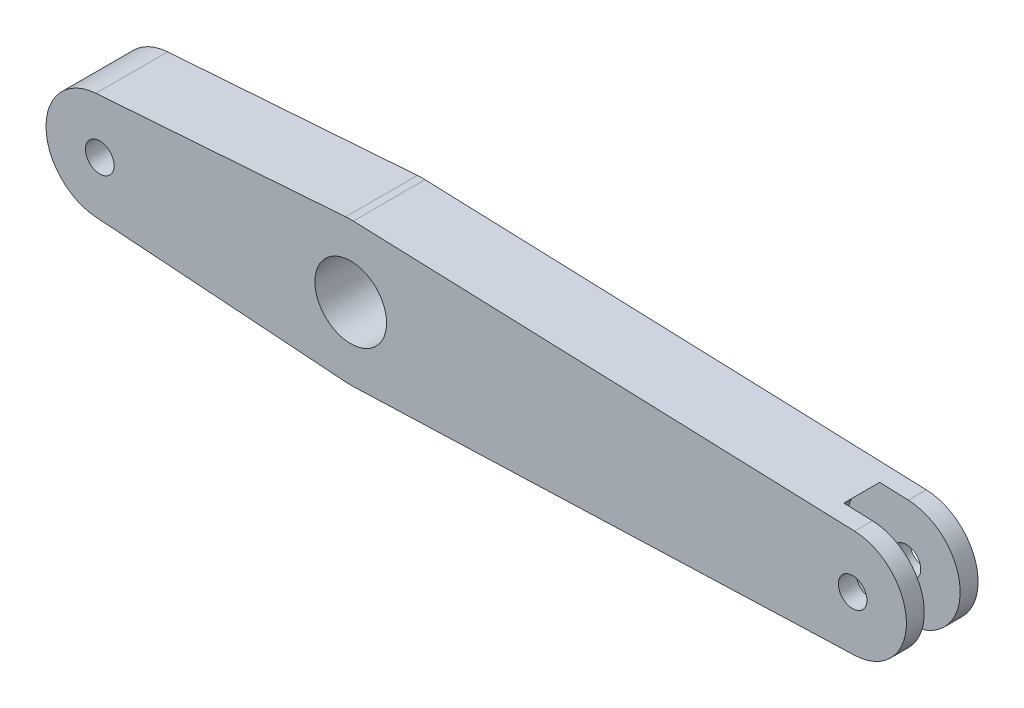
ISO-10303-21;
HEADER;
FILE_DESCRIPTION(('STEP AP214'),'2;1');
FILE_NAME('part.step','',(''),(''),'','','');
FILE_SCHEMA(('AUTOMOTIVE_DESIGN { 1 0 10303 214 1 1 1 1 }'));
ENDSEC;
DATA;
#1=APPLICATION_CONTEXT('core data for automotive mechanical design processes');
#2=APPLICATION_PROTOCOL_DEFINITION('international standard','automotive_design',2000,#1);
#3=PRODUCT_CONTEXT('',#1,'mechanical');
#4=PRODUCT('Part','Part','',(#3));
#5=PRODUCT_RELATED_PRODUCT_CATEGORY('part','',(#4));
#6=PRODUCT_DEFINITION_FORMATION('','',#4);
#7=PRODUCT_DEFINITION_CONTEXT('part definition',#1,'design');
#8=PRODUCT_DEFINITION('design','',#6,#7);
#9=PRODUCT_DEFINITION_SHAPE('','',#8);
#10=(LENGTH_UNIT() NAMED_UNIT(*) SI_UNIT(.MILLI.,.METRE.));
#11=(NAMED_UNIT(*) PLANE_ANGLE_UNIT() SI_UNIT($,.RADIAN.));
#12=(NAMED_UNIT(*) SI_UNIT($,.STERADIAN.) SOLID_ANGLE_UNIT());
#13=UNCERTAINTY_MEASURE_WITH_UNIT(LENGTH_MEASURE(1.E-05),#10,'distance_accuracy_value','');
#14=(GEOMETRIC_REPRESENTATION_CONTEXT(3) GLOBAL_UNCERTAINTY_ASSIGNED_CONTEXT((#13)) GLOBAL_UNIT_ASSIGNED_CONTEXT((#10,
#11,#12)) REPRESENTATION_CONTEXT('',''));
#15=CARTESIAN_POINT('',(0.,0.,0.));
#16=DIRECTION('',(0.,0.,1.));
#17=DIRECTION('',(1.,0.,0.));
#18=AXIS2_PLACEMENT_3D('',#15,#16,#17);
#19=CARTESIAN_POINT('',(140.,0.,20.));
#20=DIRECTION('',(0.,0.,-1.));
#21=DIRECTION('',(-1.,0.,0.));
#22=AXIS2_PLACEMENT_3D('',#19,#20,#21);
#23=CYLINDRICAL_SURFACE('',#22,15.);
#24=CARTESIAN_POINT('',(140.,0.,5.));
#25=DIRECTION('',(0.,0.,1.));
#26=DIRECTION('',(1.,0.,0.));
#27=AXIS2_PLACEMENT_3D('',#24,#25,#26);
#28=CIRCLE('',#27,15.);
#29=CARTESIAN_POINT('',(140.535714285714,-14.9904306210356,5.));
#30=VERTEX_POINT('',#29);
#31=CARTESIAN_POINT('',(140.535714285714,14.9904306210356,5.));
#32=VERTEX_POINT('',#31);
#33=EDGE_CURVE('E60',#30,#32,#28,.T.);
#34=ORIENTED_EDGE('',*,*,#33,.F.);
#35=DIRECTION('',(0.,0.,-1.));
#36=VECTOR('',#35,1.);
#37=CARTESIAN_POINT('',(140.535714285714,-14.9904306210356,20.));
#38=LINE('',#37,#36);
#39=CARTESIAN_POINT('',(140.535714285714,-14.9904306210356,0.));
#40=VERTEX_POINT('',#39);
#41=EDGE_CURVE('E178',#30,#40,#38,.T.);
#42=ORIENTED_EDGE('',*,*,#41,.T.);
#43=CARTESIAN_POINT('',(140.,0.,0.));
#44=DIRECTION('',(0.,0.,1.));
#45=DIRECTION('',(1.,0.,0.));
#46=AXIS2_PLACEMENT_3D('',#43,#44,#45);
#47=CIRCLE('',#46,15.);
#48=CARTESIAN_POINT('',(140.535714285714,14.9904306210356,0.));
#49=VERTEX_POINT('',#48);
#50=EDGE_CURVE('E166',#40,#49,#47,.T.);
#51=ORIENTED_EDGE('',*,*,#50,.T.);
#52=DIRECTION('',(0.,0.,-1.));
#53=VECTOR('',#52,1.);
#54=CARTESIAN_POINT('',(140.535714285714,14.9904306210356,20.));
#55=LINE('',#54,#53);
#56=EDGE_CURVE('E146',#32,#49,#55,.T.);
#57=ORIENTED_EDGE('',*,*,#56,.F.);
#58=EDGE_LOOP('',(#34,#42,#51,#57));
#59=FACE_BOUND('',#58,.T.);
#60=ADVANCED_FACE('F45',(#59),#23,.T.);
#61=CARTESIAN_POINT('',(140.,0.,20.));
#62=DIRECTION('',(0.,0.,-1.));
#63=DIRECTION('',(-1.,0.,0.));
#64=AXIS2_PLACEMENT_3D('',#61,#62,#63);
#65=CYLINDRICAL_SURFACE('',#64,3.99999999999999);
#66=CARTESIAN_POINT('',(140.,0.,0.));
#67=DIRECTION('',(0.,0.,1.));
#68=DIRECTION('',(1.,0.,0.));
#69=AXIS2_PLACEMENT_3D('',#66,#67,#68);
#70=CIRCLE('',#69,3.99999999999999);
#71=CARTESIAN_POINT('',(144.,0.,0.));
#72=VERTEX_POINT('',#71);
#73=EDGE_CURVE('E217',#72,#72,#70,.T.);
#74=ORIENTED_EDGE('',*,*,#73,.F.);
#75=EDGE_LOOP('',(#74));
#76=FACE_BOUND('',#75,.T.);
#77=CARTESIAN_POINT('',(140.,0.,5.));
#78=DIRECTION('',(0.,0.,1.));
#79=DIRECTION('',(1.,0.,0.));
#80=AXIS2_PLACEMENT_3D('',#77,#78,#79);
#81=CIRCLE('',#80,3.99999999999999);
#82=CARTESIAN_POINT('',(144.,0.,5.));
#83=VERTEX_POINT('',#82);
#84=EDGE_CURVE('E189',#83,#83,#81,.T.);
#85=ORIENTED_EDGE('',*,*,#84,.T.);
#86=EDGE_LOOP('',(#85));
#87=FACE_BOUND('',#86,.T.);
#88=ADVANCED_FACE('F298',(#76,#87),#65,.F.);
#89=CARTESIAN_POINT('',(-70.,0.,20.));
#90=DIRECTION('',(0.,0.,1.));
#91=DIRECTION('',(1.,0.,0.));
#92=AXIS2_PLACEMENT_3D('',#89,#90,#91);
#93=PLANE('',#92);
#94=CARTESIAN_POINT('',(-70.,0.,20.));
#95=DIRECTION('',(0.,0.,1.));
#96=DIRECTION('',(1.,0.,0.));
#97=AXIS2_PLACEMENT_3D('',#94,#95,#96);
#98=CIRCLE('',#97,4.00000000000001);
#99=CARTESIAN_POINT('',(-66.,0.,20.));
#100=VERTEX_POINT('',#99);
#101=EDGE_CURVE('E224',#100,#100,#98,.T.);
#102=ORIENTED_EDGE('',*,*,#101,.F.);
#103=EDGE_LOOP('',(#102));
#104=FACE_BOUND('',#103,.T.);
#105=CARTESIAN_POINT('',(-70.,0.,20.));
#106=DIRECTION('',(0.,0.,1.));
#107=DIRECTION('',(1.,0.,0.));
#108=AXIS2_PLACEMENT_3D('',#105,#106,#107);
#109=CIRCLE('',#108,15.);
#110=CARTESIAN_POINT('',(-71.0714285714286,14.961685761181,20.));
#111=VERTEX_POINT('',#110);
#112=CARTESIAN_POINT('',(-71.0714285714286,-14.961685761181,20.));
#113=VERTEX_POINT('',#112);
#114=EDGE_CURVE('E173',#111,#113,#109,.T.);
#115=ORIENTED_EDGE('',*,*,#114,.T.);
#116=DIRECTION('',(0.997445717412067,-0.0714285714285715,0.));
#117=VECTOR('',#116,1.);
#118=CARTESIAN_POINT('',(-71.0714285714286,-14.961685761181,20.));
#119=LINE('',#118,#117);
#120=CARTESIAN_POINT('',(-1.42857142857143,-19.9489143482413,20.));
#121=VERTEX_POINT('',#120);
#122=EDGE_CURVE('E111',#113,#121,#119,.T.);
#123=ORIENTED_EDGE('',*,*,#122,.T.);
#124=CARTESIAN_POINT('',(0.,0.,20.));
#125=DIRECTION('',(0.,0.,1.));
#126=DIRECTION('',(1.,0.,0.));
#127=AXIS2_PLACEMENT_3D('',#124,#125,#126);
#128=CIRCLE('',#127,20.);
#129=CARTESIAN_POINT('',(0.714285714285711,-19.9872408280475,20.));
#130=VERTEX_POINT('',#129);
#131=EDGE_CURVE('E236',#121,#130,#128,.T.);
#132=ORIENTED_EDGE('',*,*,#131,.T.);
#133=DIRECTION('',(0.999362041402373,0.0357142857142855,0.));
#134=VECTOR('',#133,1.);
#135=CARTESIAN_POINT('',(140.535714285714,-14.9904306210356,20.));
#136=LINE('',#135,#134);
#137=CARTESIAN_POINT('',(140.535714285714,-14.9904306210356,20.));
#138=VERTEX_POINT('',#137);
#139=EDGE_CURVE('E238',#130,#138,#136,.T.);
#140=ORIENTED_EDGE('',*,*,#139,.T.);
#141=CARTESIAN_POINT('',(140.,0.,20.));
#142=DIRECTION('',(0.,0.,1.));
#143=DIRECTION('',(1.,0.,0.));
#144=AXIS2_PLACEMENT_3D('',#141,#142,#143);
#145=CIRCLE('',#144,15.);
#146=CARTESIAN_POINT('',(140.535714285714,14.9904306210356,20.));
#147=VERTEX_POINT('',#146);
#148=EDGE_CURVE('E134',#138,#147,#145,.T.);
#149=ORIENTED_EDGE('',*,*,#148,.T.);
#150=DIRECTION('',(-0.999362041402373,0.0357142857142855,0.));
#151=VECTOR('',#150,1.);
#152=CARTESIAN_POINT('',(140.535714285714,14.9904306210356,20.));
#153=LINE('',#152,#151);
#154=CARTESIAN_POINT('',(0.71428571428571,19.9872408280475,20.));
#155=VERTEX_POINT('',#154);
#156=EDGE_CURVE('E126',#147,#155,#153,.T.);
#157=ORIENTED_EDGE('',*,*,#156,.T.);
#158=CARTESIAN_POINT('',(0.,0.,20.));
#159=DIRECTION('',(0.,0.,1.));
#160=DIRECTION('',(1.,0.,0.));
#161=AXIS2_PLACEMENT_3D('',#158,#159,#160);
#162=CIRCLE('',#161,20.);
#163=CARTESIAN_POINT('',(-1.42857142857143,19.9489143482413,20.));
#164=VERTEX_POINT('',#163);
#165=EDGE_CURVE('E131',#155,#164,#162,.T.);
#166=ORIENTED_EDGE('',*,*,#165,.T.);
#167=DIRECTION('',(-0.997445717412067,-0.0714285714285714,0.));
#168=VECTOR('',#167,1.);
#169=CARTESIAN_POINT('',(-71.0714285714286,14.961685761181,20.));
#170=LINE('',#169,#168);
#171=EDGE_CURVE('E69',#164,#111,#170,.T.);
#172=ORIENTED_EDGE('',*,*,#171,.T.);
#173=EDGE_LOOP('',(#115,#123,#132,#140,#149,#157,#166,#172));
#174=FACE_BOUND('',#173,.T.);
#175=CARTESIAN_POINT('',(0.,0.,20.));
#176=DIRECTION('',(0.,0.,1.));
#177=DIRECTION('',(1.,0.,0.));
#178=AXIS2_PLACEMENT_3D('',#175,#176,#177);
#179=CIRCLE('',#178,10.);
#180=CARTESIAN_POINT('',(10.,0.,20.));
#181=VERTEX_POINT('',#180);
#182=EDGE_CURVE('E159',#181,#181,#179,.T.);
#183=ORIENTED_EDGE('',*,*,#182,.F.);
#184=EDGE_LOOP('',(#183));
#185=FACE_BOUND('',#184,.T.);
#186=CARTESIAN_POINT('',(140.,0.,20.));
#187=DIRECTION('',(0.,0.,1.));
#188=DIRECTION('',(1.,0.,0.));
#189=AXIS2_PLACEMENT_3D('',#186,#187,#188);
#190=CIRCLE('',#189,3.99999999999999);
#191=CARTESIAN_POINT('',(144.,0.,20.));
#192=VERTEX_POINT('',#191);
#193=EDGE_CURVE('E218',#192,#192,#190,.T.);
#194=ORIENTED_EDGE('',*,*,#193,.F.);
#195=EDGE_LOOP('',(#194));
#196=FACE_BOUND('',#195,.T.);
#197=ADVANCED_FACE('F128',(#104,#174,#185,#196),#93,.T.);
#198=CARTESIAN_POINT('',(-70.,0.,0.));
#199=DIRECTION('',(0.,0.,1.));
#200=DIRECTION('',(1.,0.,0.));
#201=AXIS2_PLACEMENT_3D('',#198,#199,#200);
#202=PLANE('',#201);
#203=CARTESIAN_POINT('',(-70.,0.,0.));
#204=DIRECTION('',(0.,0.,1.));
#205=DIRECTION('',(1.,0.,0.));
#206=AXIS2_PLACEMENT_3D('',#203,#204,#205);
#207=CIRCLE('',#206,15.);
#208=CARTESIAN_POINT('',(-71.0714285714286,14.961685761181,0.));
#209=VERTEX_POINT('',#208);
#210=CARTESIAN_POINT('',(-71.0714285714286,-14.961685761181,0.));
#211=VERTEX_POINT('',#210);
#212=EDGE_CURVE('E155',#209,#211,#207,.T.);
#213=ORIENTED_EDGE('',*,*,#212,.F.);
#214=DIRECTION('',(-0.997445717412067,-0.0714285714285714,0.));
#215=VECTOR('',#214,1.);
#216=CARTESIAN_POINT('',(-71.0714285714286,14.961685761181,0.));
#217=LINE('',#216,#215);
#218=CARTESIAN_POINT('',(-1.42857142857143,19.9489143482413,0.));
#219=VERTEX_POINT('',#218);
#220=EDGE_CURVE('E102',#219,#209,#217,.T.);
#221=ORIENTED_EDGE('',*,*,#220,.F.);
#222=CARTESIAN_POINT('',(0.,0.,0.));
#223=DIRECTION('',(0.,0.,1.));
#224=DIRECTION('',(1.,0.,0.));
#225=AXIS2_PLACEMENT_3D('',#222,#223,#224);
#226=CIRCLE('',#225,20.);
#227=CARTESIAN_POINT('',(0.71428571428571,19.9872408280475,0.));
#228=VERTEX_POINT('',#227);
#229=EDGE_CURVE('E170',#228,#219,#226,.T.);
#230=ORIENTED_EDGE('',*,*,#229,.F.);
#231=DIRECTION('',(-0.999362041402373,0.0357142857142855,0.));
#232=VECTOR('',#231,1.);
#233=CARTESIAN_POINT('',(140.535714285714,14.9904306210356,0.));
#234=LINE('',#233,#232);
#235=EDGE_CURVE('E143',#49,#228,#234,.T.);
#236=ORIENTED_EDGE('',*,*,#235,.F.);
#237=ORIENTED_EDGE('',*,*,#50,.F.);
#238=DIRECTION('',(0.999362041402373,0.0357142857142855,0.));
#239=VECTOR('',#238,1.);
#240=CARTESIAN_POINT('',(140.535714285714,-14.9904306210356,0.));
#241=LINE('',#240,#239);
#242=CARTESIAN_POINT('',(0.714285714285711,-19.9872408280475,0.));
#243=VERTEX_POINT('',#242);
#244=EDGE_CURVE('E163',#243,#40,#241,.T.);
#245=ORIENTED_EDGE('',*,*,#244,.F.);
#246=CARTESIAN_POINT('',(0.,0.,0.));
#247=DIRECTION('',(0.,0.,1.));
#248=DIRECTION('',(1.,0.,0.));
#249=AXIS2_PLACEMENT_3D('',#246,#247,#248);
#250=CIRCLE('',#249,20.);
#251=CARTESIAN_POINT('',(-1.42857142857143,-19.9489143482413,0.));
#252=VERTEX_POINT('',#251);
#253=EDGE_CURVE('E161',#252,#243,#250,.T.);
#254=ORIENTED_EDGE('',*,*,#253,.F.);
#255=DIRECTION('',(0.997445717412067,-0.0714285714285715,0.));
#256=VECTOR('',#255,1.);
#257=CARTESIAN_POINT('',(-71.0714285714286,-14.961685761181,0.));
#258=LINE('',#257,#256);
#259=EDGE_CURVE('E158',#211,#252,#258,.T.);
#260=ORIENTED_EDGE('',*,*,#259,.F.);
#261=EDGE_LOOP('',(#213,#221,#230,#236,#237,#245,#254,#260));
#262=FACE_BOUND('',#261,.T.);
#263=CARTESIAN_POINT('',(0.,0.,0.));
#264=DIRECTION('',(0.,0.,1.));
#265=DIRECTION('',(1.,0.,0.));
#266=AXIS2_PLACEMENT_3D('',#263,#264,#265);
#267=CIRCLE('',#266,10.);
#268=CARTESIAN_POINT('',(10.,0.,0.));
#269=VERTEX_POINT('',#268);
#270=EDGE_CURVE('E227',#269,#269,#267,.T.);
#271=ORIENTED_EDGE('',*,*,#270,.T.);
#272=EDGE_LOOP('',(#271));
#273=FACE_BOUND('',#272,.T.);
#274=CARTESIAN_POINT('',(-70.,0.,0.));
#275=DIRECTION('',(0.,0.,1.));
#276=DIRECTION('',(1.,0.,0.));
#277=AXIS2_PLACEMENT_3D('',#274,#275,#276);
#278=CIRCLE('',#277,4.00000000000001);
#279=CARTESIAN_POINT('',(-66.,0.,0.));
#280=VERTEX_POINT('',#279);
#281=EDGE_CURVE('E221',#280,#280,#278,.T.);
#282=ORIENTED_EDGE('',*,*,#281,.T.);
#283=EDGE_LOOP('',(#282));
#284=FACE_BOUND('',#283,.T.);
#285=ORIENTED_EDGE('',*,*,#73,.T.);
#286=EDGE_LOOP('',(#285));
#287=FACE_BOUND('',#286,.T.);
#288=ADVANCED_FACE('F279',(#262,#273,#284,#287),#202,.F.);
#289=CARTESIAN_POINT('',(-70.,0.,20.));
#290=DIRECTION('',(0.,0.,-1.));
#291=DIRECTION('',(-1.,0.,0.));
#292=AXIS2_PLACEMENT_3D('',#289,#290,#291);
#293=CYLINDRICAL_SURFACE('',#292,15.);
#294=ORIENTED_EDGE('',*,*,#212,.T.);
#295=DIRECTION('',(0.,0.,-1.));
#296=VECTOR('',#295,1.);
#297=CARTESIAN_POINT('',(-71.0714285714286,-14.961685761181,20.));
#298=LINE('',#297,#296);
#299=EDGE_CURVE('E53',#113,#211,#298,.T.);
#300=ORIENTED_EDGE('',*,*,#299,.F.);
#301=ORIENTED_EDGE('',*,*,#114,.F.);
#302=DIRECTION('',(0.,0.,-1.));
#303=VECTOR('',#302,1.);
#304=CARTESIAN_POINT('',(-71.0714285714286,14.961685761181,20.));
#305=LINE('',#304,#303);
#306=EDGE_CURVE('E151',#111,#209,#305,.T.);
#307=ORIENTED_EDGE('',*,*,#306,.T.);
#308=EDGE_LOOP('',(#294,#300,#301,#307));
#309=FACE_BOUND('',#308,.T.);
#310=ADVANCED_FACE('F47',(#309),#293,.T.);
#311=CARTESIAN_POINT('',(-71.0714285714286,-14.961685761181,20.));
#312=DIRECTION('',(0.0714285714285715,0.997445717412067,0.));
#313=DIRECTION('',(-0.997445717412067,0.0714285714285715,0.));
#314=AXIS2_PLACEMENT_3D('',#311,#312,#313);
#315=PLANE('',#314);
#316=ORIENTED_EDGE('',*,*,#259,.T.);
#317=DIRECTION('',(0.,0.,-1.));
#318=VECTOR('',#317,1.);
#319=CARTESIAN_POINT('',(-1.42857142857143,-19.9489143482413,20.));
#320=LINE('',#319,#318);
#321=EDGE_CURVE('E185',#121,#252,#320,.T.);
#322=ORIENTED_EDGE('',*,*,#321,.F.);
#323=ORIENTED_EDGE('',*,*,#122,.F.);
#324=ORIENTED_EDGE('',*,*,#299,.T.);
#325=EDGE_LOOP('',(#316,#322,#323,#324));
#326=FACE_BOUND('',#325,.T.);
#327=ADVANCED_FACE('F285',(#326),#315,.F.);
#328=CARTESIAN_POINT('',(0.,0.,20.));
#329=DIRECTION('',(0.,0.,-1.));
#330=DIRECTION('',(-1.,0.,0.));
#331=AXIS2_PLACEMENT_3D('',#328,#329,#330);
#332=CYLINDRICAL_SURFACE('',#331,20.);
#333=ORIENTED_EDGE('',*,*,#253,.T.);
#334=DIRECTION('',(0.,0.,-1.));
#335=VECTOR('',#334,1.);
#336=CARTESIAN_POINT('',(0.714285714285711,-19.9872408280475,20.));
#337=LINE('',#336,#335);
#338=EDGE_CURVE('E182',#130,#243,#337,.T.);
#339=ORIENTED_EDGE('',*,*,#338,.F.);
#340=ORIENTED_EDGE('',*,*,#131,.F.);
#341=ORIENTED_EDGE('',*,*,#321,.T.);
#342=EDGE_LOOP('',(#333,#339,#340,#341));
#343=FACE_BOUND('',#342,.T.);
#344=ADVANCED_FACE('F288',(#343),#332,.T.);
#345=CARTESIAN_POINT('',(140.535714285714,-14.9904306210356,20.));
#346=DIRECTION('',(-0.0357142857142855,0.999362041402373,0.));
#347=DIRECTION('',(-0.999362041402373,-0.0357142857142855,0.));
#348=AXIS2_PLACEMENT_3D('',#345,#346,#347);
#349=PLANE('',#348);
#350=DIRECTION('',(0.,0.,-1.));
#351=VECTOR('',#350,1.);
#352=CARTESIAN_POINT('',(132.540817954495,-15.2761449067499,15.));
#353=LINE('',#352,#351);
#354=CARTESIAN_POINT('',(132.540817954495,-15.2761449067499,15.));
#355=VERTEX_POINT('',#354);
#356=CARTESIAN_POINT('',(132.540817954495,-15.2761449067499,5.));
#357=VERTEX_POINT('',#356);
#358=EDGE_CURVE('E214',#355,#357,#353,.T.);
#359=ORIENTED_EDGE('',*,*,#358,.F.);
#360=DIRECTION('',(0.999362041402373,0.0357142857142855,0.));
#361=VECTOR('',#360,1.);
#362=CARTESIAN_POINT('',(140.535714285714,-14.9904306210356,15.));
#363=LINE('',#362,#361);
#364=CARTESIAN_POINT('',(140.535714285714,-14.9904306210356,15.));
#365=VERTEX_POINT('',#364);
#366=EDGE_CURVE('E211',#355,#365,#363,.T.);
#367=ORIENTED_EDGE('',*,*,#366,.T.);
#368=EDGE_CURVE('E179',#138,#365,#38,.T.);
#369=ORIENTED_EDGE('',*,*,#368,.F.);
#370=ORIENTED_EDGE('',*,*,#139,.F.);
#371=ORIENTED_EDGE('',*,*,#338,.T.);
#372=ORIENTED_EDGE('',*,*,#244,.T.);
#373=ORIENTED_EDGE('',*,*,#41,.F.);
#374=DIRECTION('',(0.999362041402373,0.0357142857142855,0.));
#375=VECTOR('',#374,1.);
#376=CARTESIAN_POINT('',(140.535714285714,-14.9904306210356,5.));
#377=LINE('',#376,#375);
#378=EDGE_CURVE('E196',#357,#30,#377,.T.);
#379=ORIENTED_EDGE('',*,*,#378,.F.);
#380=EDGE_LOOP('',(#359,#367,#369,#370,#371,#372,#373,#379));
#381=FACE_BOUND('',#380,.T.);
#382=ADVANCED_FACE('F245',(#381),#349,.F.);
#383=ORIENTED_EDGE('',*,*,#368,.T.);
#384=CARTESIAN_POINT('',(140.,0.,15.));
#385=DIRECTION('',(0.,0.,1.));
#386=DIRECTION('',(1.,0.,0.));
#387=AXIS2_PLACEMENT_3D('',#384,#385,#386);
#388=CIRCLE('',#387,15.);
#389=CARTESIAN_POINT('',(140.535714285714,14.9904306210356,15.));
#390=VERTEX_POINT('',#389);
#391=EDGE_CURVE('E200',#365,#390,#388,.T.);
#392=ORIENTED_EDGE('',*,*,#391,.T.);
#393=EDGE_CURVE('E176',#147,#390,#55,.T.);
#394=ORIENTED_EDGE('',*,*,#393,.F.);
#395=ORIENTED_EDGE('',*,*,#148,.F.);
#396=EDGE_LOOP('',(#383,#392,#394,#395));
#397=FACE_BOUND('',#396,.T.);
#398=ADVANCED_FACE('F248',(#397),#23,.T.);
#399=CARTESIAN_POINT('',(140.535714285714,14.9904306210356,20.));
#400=DIRECTION('',(-0.0357142857142855,-0.999362041402373,0.));
#401=DIRECTION('',(0.999362041402373,-0.0357142857142855,0.));
#402=AXIS2_PLACEMENT_3D('',#399,#400,#401);
#403=PLANE('',#402);
#404=ORIENTED_EDGE('',*,*,#393,.T.);
#405=DIRECTION('',(-0.999362041402373,0.0357142857142855,0.));
#406=VECTOR('',#405,1.);
#407=CARTESIAN_POINT('',(140.535714285714,14.9904306210356,15.));
#408=LINE('',#407,#406);
#409=CARTESIAN_POINT('',(132.540817954495,15.2761449067499,15.));
#410=VERTEX_POINT('',#409);
#411=EDGE_CURVE('E195',#390,#410,#408,.T.);
#412=ORIENTED_EDGE('',*,*,#411,.T.);
#413=DIRECTION('',(0.,0.,-1.));
#414=VECTOR('',#413,1.);
#415=CARTESIAN_POINT('',(132.540817954495,15.2761449067499,15.));
#416=LINE('',#415,#414);
#417=CARTESIAN_POINT('',(132.540817954495,15.2761449067499,5.));
#418=VERTEX_POINT('',#417);
#419=EDGE_CURVE('E11',#418,#410,#416,.F.);
#420=ORIENTED_EDGE('',*,*,#419,.F.);
#421=DIRECTION('',(-0.999362041402373,0.0357142857142855,0.));
#422=VECTOR('',#421,1.);
#423=CARTESIAN_POINT('',(140.535714285714,14.9904306210356,5.));
#424=LINE('',#423,#422);
#425=EDGE_CURVE('E191',#32,#418,#424,.T.);
#426=ORIENTED_EDGE('',*,*,#425,.F.);
#427=ORIENTED_EDGE('',*,*,#56,.T.);
#428=ORIENTED_EDGE('',*,*,#235,.T.);
#429=DIRECTION('',(0.,0.,-1.));
#430=VECTOR('',#429,1.);
#431=CARTESIAN_POINT('',(0.71428571428571,19.9872408280475,20.));
#432=LINE('',#431,#430);
#433=EDGE_CURVE('E140',#155,#228,#432,.T.);
#434=ORIENTED_EDGE('',*,*,#433,.F.);
#435=ORIENTED_EDGE('',*,*,#156,.F.);
#436=EDGE_LOOP('',(#404,#412,#420,#426,#427,#428,#434,#435));
#437=FACE_BOUND('',#436,.T.);
#438=ADVANCED_FACE('F141',(#437),#403,.F.);
#439=CARTESIAN_POINT('',(0.,0.,20.));
#440=DIRECTION('',(0.,0.,-1.));
#441=DIRECTION('',(-1.,0.,0.));
#442=AXIS2_PLACEMENT_3D('',#439,#440,#441);
#443=CYLINDRICAL_SURFACE('',#442,20.);
#444=ORIENTED_EDGE('',*,*,#229,.T.);
#445=DIRECTION('',(0.,0.,-1.));
#446=VECTOR('',#445,1.);
#447=CARTESIAN_POINT('',(-1.42857142857143,19.9489143482413,20.));
#448=LINE('',#447,#446);
#449=EDGE_CURVE('E147',#164,#219,#448,.T.);
#450=ORIENTED_EDGE('',*,*,#449,.F.);
#451=ORIENTED_EDGE('',*,*,#165,.F.);
#452=ORIENTED_EDGE('',*,*,#433,.T.);
#453=EDGE_LOOP('',(#444,#450,#451,#452));
#454=FACE_BOUND('',#453,.T.);
#455=ADVANCED_FACE('F149',(#454),#443,.T.);
#456=CARTESIAN_POINT('',(-71.0714285714286,14.961685761181,20.));
#457=DIRECTION('',(0.0714285714285714,-0.997445717412067,0.));
#458=DIRECTION('',(0.997445717412067,0.0714285714285714,0.));
#459=AXIS2_PLACEMENT_3D('',#456,#457,#458);
#460=PLANE('',#459);
#461=ORIENTED_EDGE('',*,*,#220,.T.);
#462=ORIENTED_EDGE('',*,*,#306,.F.);
#463=ORIENTED_EDGE('',*,*,#171,.F.);
#464=ORIENTED_EDGE('',*,*,#449,.T.);
#465=EDGE_LOOP('',(#461,#462,#463,#464));
#466=FACE_BOUND('',#465,.T.);
#467=ADVANCED_FACE('F281',(#466),#460,.F.);
#468=CARTESIAN_POINT('',(0.,0.,20.));
#469=DIRECTION('',(0.,0.,-1.));
#470=DIRECTION('',(-1.,0.,0.));
#471=AXIS2_PLACEMENT_3D('',#468,#469,#470);
#472=CYLINDRICAL_SURFACE('',#471,10.);
#473=ORIENTED_EDGE('',*,*,#182,.T.);
#474=EDGE_LOOP('',(#473));
#475=FACE_BOUND('',#474,.T.);
#476=ORIENTED_EDGE('',*,*,#270,.F.);
#477=EDGE_LOOP('',(#476));
#478=FACE_BOUND('',#477,.T.);
#479=ADVANCED_FACE('F319',(#475,#478),#472,.F.);
#480=CARTESIAN_POINT('',(-70.,0.,20.));
#481=DIRECTION('',(0.,0.,-1.));
#482=DIRECTION('',(-1.,0.,0.));
#483=AXIS2_PLACEMENT_3D('',#480,#481,#482);
#484=CYLINDRICAL_SURFACE('',#483,4.00000000000001);
#485=ORIENTED_EDGE('',*,*,#101,.T.);
#486=EDGE_LOOP('',(#485));
#487=FACE_BOUND('',#486,.T.);
#488=ORIENTED_EDGE('',*,*,#281,.F.);
#489=EDGE_LOOP('',(#488));
#490=FACE_BOUND('',#489,.T.);
#491=ADVANCED_FACE('F327',(#487,#490),#484,.F.);
#492=CARTESIAN_POINT('',(140.,0.,15.));
#493=DIRECTION('',(0.,0.,1.));
#494=DIRECTION('',(1.,0.,0.));
#495=AXIS2_PLACEMENT_3D('',#492,#493,#494);
#496=CIRCLE('',#495,3.99999999999999);
#497=CARTESIAN_POINT('',(144.,0.,15.));
#498=VERTEX_POINT('',#497);
#499=EDGE_CURVE('E193',#498,#498,#496,.T.);
#500=ORIENTED_EDGE('',*,*,#499,.F.);
#501=EDGE_LOOP('',(#500));
#502=FACE_BOUND('',#501,.T.);
#503=ORIENTED_EDGE('',*,*,#193,.T.);
#504=EDGE_LOOP('',(#503));
#505=FACE_BOUND('',#504,.T.);
#506=ADVANCED_FACE('F306',(#502,#505),#65,.F.);
#507=CARTESIAN_POINT('',(140.,0.,15.));
#508=DIRECTION('',(0.,0.,-1.));
#509=DIRECTION('',(-1.,0.,0.));
#510=AXIS2_PLACEMENT_3D('',#507,#508,#509);
#511=CYLINDRICAL_SURFACE('',#510,17.);
#512=ORIENTED_EDGE('',*,*,#358,.T.);
#513=CARTESIAN_POINT('',(140.,0.,5.));
#514=DIRECTION('',(0.,0.,1.));
#515=DIRECTION('',(1.,0.,0.));
#516=AXIS2_PLACEMENT_3D('',#513,#514,#515);
#517=CIRCLE('',#516,17.);
#518=EDGE_CURVE('E266',#418,#357,#517,.T.);
#519=ORIENTED_EDGE('',*,*,#518,.F.);
#520=ORIENTED_EDGE('',*,*,#419,.T.);
#521=CARTESIAN_POINT('',(140.,0.,15.));
#522=DIRECTION('',(0.,0.,1.));
#523=DIRECTION('',(1.,0.,0.));
#524=AXIS2_PLACEMENT_3D('',#521,#522,#523);
#525=CIRCLE('',#524,17.);
#526=EDGE_CURVE('E192',#410,#355,#525,.T.);
#527=ORIENTED_EDGE('',*,*,#526,.T.);
#528=EDGE_LOOP('',(#512,#519,#520,#527));
#529=FACE_BOUND('',#528,.T.);
#530=ADVANCED_FACE('F269',(#529),#511,.F.);
#531=CARTESIAN_POINT('',(140.,0.,15.));
#532=DIRECTION('',(0.,0.,1.));
#533=DIRECTION('',(1.,0.,0.));
#534=AXIS2_PLACEMENT_3D('',#531,#532,#533);
#535=PLANE('',#534);
#536=ORIENTED_EDGE('',*,*,#499,.T.);
#537=EDGE_LOOP('',(#536));
#538=FACE_BOUND('',#537,.T.);
#539=ORIENTED_EDGE('',*,*,#526,.F.);
#540=ORIENTED_EDGE('',*,*,#411,.F.);
#541=ORIENTED_EDGE('',*,*,#391,.F.);
#542=ORIENTED_EDGE('',*,*,#366,.F.);
#543=EDGE_LOOP('',(#539,#540,#541,#542));
#544=FACE_BOUND('',#543,.T.);
#545=ADVANCED_FACE('F334',(#538,#544),#535,.F.);
#546=CARTESIAN_POINT('',(140.,0.,5.));
#547=DIRECTION('',(0.,0.,1.));
#548=DIRECTION('',(1.,0.,0.));
#549=AXIS2_PLACEMENT_3D('',#546,#547,#548);
#550=PLANE('',#549);
#551=ORIENTED_EDGE('',*,*,#84,.F.);
#552=EDGE_LOOP('',(#551));
#553=FACE_BOUND('',#552,.T.);
#554=ORIENTED_EDGE('',*,*,#378,.T.);
#555=ORIENTED_EDGE('',*,*,#33,.T.);
#556=ORIENTED_EDGE('',*,*,#425,.T.);
#557=ORIENTED_EDGE('',*,*,#518,.T.);
#558=EDGE_LOOP('',(#554,#555,#556,#557));
#559=FACE_BOUND('',#558,.T.);
#560=ADVANCED_FACE('F265',(#553,#559),#550,.T.);
#561=CLOSED_SHELL('',(#60,#88,#197,#288,#310,#327,#344,#382,#398,#438,#455,#467,#479,#491,#506,
#530,#545,#560));
#562=MANIFOLD_SOLID_BREP('B2',#561);
#563=ADVANCED_BREP_SHAPE_REPRESENTATION('',(#18,#562),#14);
#564=SHAPE_DEFINITION_REPRESENTATION(#9,#563);
ENDSEC;
END-ISO-10303-21;
